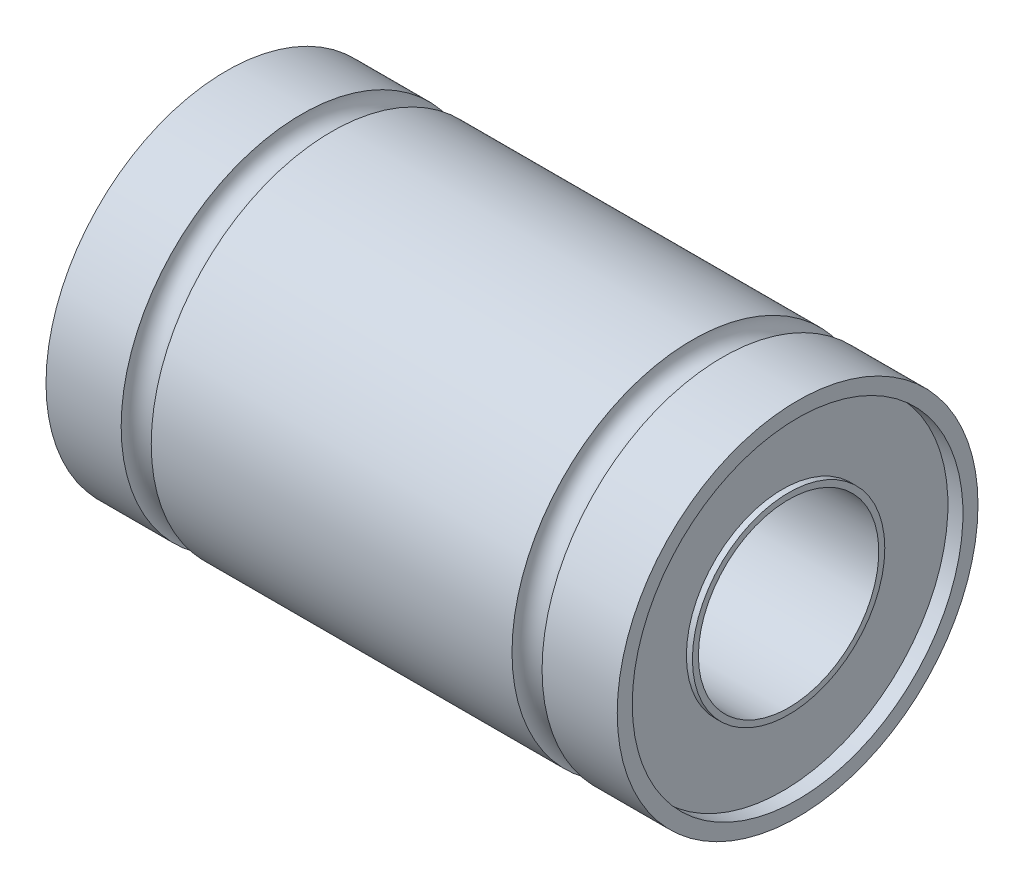
ISO-10303-21;
HEADER;
FILE_DESCRIPTION(('STEP AP214'),'2;1');
FILE_NAME('part.step','',(''),(''),'','','');
FILE_SCHEMA(('AUTOMOTIVE_DESIGN { 1 0 10303 214 1 1 1 1 }'));
ENDSEC;
DATA;
#1=APPLICATION_CONTEXT('core data for automotive mechanical design processes');
#2=APPLICATION_PROTOCOL_DEFINITION('international standard','automotive_design',2000,#1);
#3=PRODUCT_CONTEXT('',#1,'mechanical');
#4=PRODUCT('Part','Part','',(#3));
#5=PRODUCT_RELATED_PRODUCT_CATEGORY('part','',(#4));
#6=PRODUCT_DEFINITION_FORMATION('','',#4);
#7=PRODUCT_DEFINITION_CONTEXT('part definition',#1,'design');
#8=PRODUCT_DEFINITION('design','',#6,#7);
#9=PRODUCT_DEFINITION_SHAPE('','',#8);
#10=(LENGTH_UNIT() NAMED_UNIT(*) SI_UNIT(.MILLI.,.METRE.));
#11=(NAMED_UNIT(*) PLANE_ANGLE_UNIT() SI_UNIT($,.RADIAN.));
#12=(NAMED_UNIT(*) SI_UNIT($,.STERADIAN.) SOLID_ANGLE_UNIT());
#13=UNCERTAINTY_MEASURE_WITH_UNIT(LENGTH_MEASURE(1.E-05),#10,'distance_accuracy_value','');
#14=(GEOMETRIC_REPRESENTATION_CONTEXT(3) GLOBAL_UNCERTAINTY_ASSIGNED_CONTEXT((#13)) GLOBAL_UNIT_ASSIGNED_CONTEXT((#10,
#11,#12)) REPRESENTATION_CONTEXT('',''));
#15=CARTESIAN_POINT('',(0.,0.,0.));
#16=DIRECTION('',(0.,0.,1.));
#17=DIRECTION('',(1.,0.,0.));
#18=AXIS2_PLACEMENT_3D('',#15,#16,#17);
#19=CARTESIAN_POINT('',(19.,5.5,0.));
#20=DIRECTION('',(-1.,0.,0.));
#21=DIRECTION('',(0.,0.,1.));
#22=AXIS2_PLACEMENT_3D('',#19,#20,#21);
#23=PLANE('',#22);
#24=CARTESIAN_POINT('',(19.,0.,0.));
#25=DIRECTION('',(-1.,0.,0.));
#26=DIRECTION('',(0.,0.,1.));
#27=AXIS2_PLACEMENT_3D('',#24,#25,#26);
#28=CIRCLE('',#27,6.);
#29=CARTESIAN_POINT('',(19.,0.,6.));
#30=VERTEX_POINT('',#29);
#31=EDGE_CURVE('E10',#30,#30,#28,.T.);
#32=ORIENTED_EDGE('',*,*,#31,.F.);
#33=EDGE_LOOP('',(#32));
#34=FACE_BOUND('',#33,.T.);
#35=CARTESIAN_POINT('',(19.,0.,0.));
#36=DIRECTION('',(-1.,0.,0.));
#37=DIRECTION('',(0.,0.,1.));
#38=AXIS2_PLACEMENT_3D('',#35,#36,#37);
#39=CIRCLE('',#38,5.5);
#40=CARTESIAN_POINT('',(19.,0.,5.5));
#41=VERTEX_POINT('',#40);
#42=EDGE_CURVE('E88',#41,#41,#39,.T.);
#43=ORIENTED_EDGE('',*,*,#42,.T.);
#44=EDGE_LOOP('',(#43));
#45=FACE_BOUND('',#44,.T.);
#46=ADVANCED_FACE('F36',(#34,#45),#23,.F.);
#47=CARTESIAN_POINT('',(-0.95,0.,0.));
#48=DIRECTION('',(-1.,0.,0.));
#49=DIRECTION('',(0.,0.,1.));
#50=AXIS2_PLACEMENT_3D('',#47,#48,#49);
#51=CYLINDRICAL_SURFACE('',#50,6.);
#52=CARTESIAN_POINT('',(16.5,0.,0.));
#53=DIRECTION('',(-1.,0.,0.));
#54=DIRECTION('',(0.,0.,1.));
#55=AXIS2_PLACEMENT_3D('',#52,#53,#54);
#56=CIRCLE('',#55,6.);
#57=CARTESIAN_POINT('',(16.5,0.,6.));
#58=VERTEX_POINT('',#57);
#59=EDGE_CURVE('E42',#58,#58,#56,.T.);
#60=ORIENTED_EDGE('',*,*,#59,.F.);
#61=EDGE_LOOP('',(#60));
#62=FACE_BOUND('',#61,.T.);
#63=ORIENTED_EDGE('',*,*,#31,.T.);
#64=EDGE_LOOP('',(#63));
#65=FACE_BOUND('',#64,.T.);
#66=ADVANCED_FACE('F173',(#62,#65),#51,.T.);
#67=CARTESIAN_POINT('',(16.,0.,0.));
#68=DIRECTION('',(-1.,0.,0.));
#69=DIRECTION('',(0.,0.,1.));
#70=AXIS2_PLACEMENT_3D('',#67,#68,#69);
#71=TOROIDAL_SURFACE('',#70,6.,0.5);
#72=CARTESIAN_POINT('',(15.5,0.,0.));
#73=DIRECTION('',(-1.,0.,0.));
#74=DIRECTION('',(0.,0.,1.));
#75=AXIS2_PLACEMENT_3D('',#72,#73,#74);
#76=CIRCLE('',#75,6.);
#77=CARTESIAN_POINT('',(15.5,0.,6.));
#78=VERTEX_POINT('',#77);
#79=EDGE_CURVE('E46',#78,#78,#76,.T.);
#80=ORIENTED_EDGE('',*,*,#79,.F.);
#81=EDGE_LOOP('',(#80));
#82=FACE_BOUND('',#81,.T.);
#83=ORIENTED_EDGE('',*,*,#59,.T.);
#84=EDGE_LOOP('',(#83));
#85=FACE_BOUND('',#84,.T.);
#86=ADVANCED_FACE('F168',(#82,#85),#71,.F.);
#87=CARTESIAN_POINT('',(-0.95,0.,0.));
#88=DIRECTION('',(-1.,0.,0.));
#89=DIRECTION('',(0.,0.,1.));
#90=AXIS2_PLACEMENT_3D('',#87,#88,#89);
#91=CYLINDRICAL_SURFACE('',#90,6.);
#92=CARTESIAN_POINT('',(3.5,0.,0.));
#93=DIRECTION('',(-1.,0.,0.));
#94=DIRECTION('',(0.,0.,1.));
#95=AXIS2_PLACEMENT_3D('',#92,#93,#94);
#96=CIRCLE('',#95,6.);
#97=CARTESIAN_POINT('',(3.5,0.,6.));
#98=VERTEX_POINT('',#97);
#99=EDGE_CURVE('E50',#98,#98,#96,.T.);
#100=ORIENTED_EDGE('',*,*,#99,.F.);
#101=EDGE_LOOP('',(#100));
#102=FACE_BOUND('',#101,.T.);
#103=ORIENTED_EDGE('',*,*,#79,.T.);
#104=EDGE_LOOP('',(#103));
#105=FACE_BOUND('',#104,.T.);
#106=ADVANCED_FACE('F162',(#102,#105),#91,.T.);
#107=CARTESIAN_POINT('',(3.,0.,0.));
#108=DIRECTION('',(-1.,0.,0.));
#109=DIRECTION('',(0.,0.,1.));
#110=AXIS2_PLACEMENT_3D('',#107,#108,#109);
#111=TOROIDAL_SURFACE('',#110,6.,0.5);
#112=CARTESIAN_POINT('',(2.5,0.,0.));
#113=DIRECTION('',(-1.,0.,0.));
#114=DIRECTION('',(0.,0.,1.));
#115=AXIS2_PLACEMENT_3D('',#112,#113,#114);
#116=CIRCLE('',#115,6.);
#117=CARTESIAN_POINT('',(2.5,0.,6.));
#118=VERTEX_POINT('',#117);
#119=EDGE_CURVE('E55',#118,#118,#116,.T.);
#120=ORIENTED_EDGE('',*,*,#119,.F.);
#121=EDGE_LOOP('',(#120));
#122=FACE_BOUND('',#121,.T.);
#123=ORIENTED_EDGE('',*,*,#99,.T.);
#124=EDGE_LOOP('',(#123));
#125=FACE_BOUND('',#124,.T.);
#126=ADVANCED_FACE('F156',(#122,#125),#111,.F.);
#127=CARTESIAN_POINT('',(-0.95,0.,0.));
#128=DIRECTION('',(-1.,0.,0.));
#129=DIRECTION('',(0.,0.,1.));
#130=AXIS2_PLACEMENT_3D('',#127,#128,#129);
#131=CYLINDRICAL_SURFACE('',#130,6.);
#132=CARTESIAN_POINT('',(0.,0.,0.));
#133=DIRECTION('',(-1.,0.,0.));
#134=DIRECTION('',(0.,0.,1.));
#135=AXIS2_PLACEMENT_3D('',#132,#133,#134);
#136=CIRCLE('',#135,6.);
#137=CARTESIAN_POINT('',(0.,0.,6.));
#138=VERTEX_POINT('',#137);
#139=EDGE_CURVE('E58',#138,#138,#136,.T.);
#140=ORIENTED_EDGE('',*,*,#139,.F.);
#141=EDGE_LOOP('',(#140));
#142=FACE_BOUND('',#141,.T.);
#143=ORIENTED_EDGE('',*,*,#119,.T.);
#144=EDGE_LOOP('',(#143));
#145=FACE_BOUND('',#144,.T.);
#146=ADVANCED_FACE('F150',(#142,#145),#131,.T.);
#147=CARTESIAN_POINT('',(0.,5.5,0.));
#148=DIRECTION('',(1.,0.,0.));
#149=DIRECTION('',(0.,0.,-1.));
#150=AXIS2_PLACEMENT_3D('',#147,#148,#149);
#151=PLANE('',#150);
#152=CARTESIAN_POINT('',(0.,0.,0.));
#153=DIRECTION('',(-1.,0.,0.));
#154=DIRECTION('',(0.,0.,1.));
#155=AXIS2_PLACEMENT_3D('',#152,#153,#154);
#156=CIRCLE('',#155,5.5);
#157=CARTESIAN_POINT('',(0.,0.,5.5));
#158=VERTEX_POINT('',#157);
#159=EDGE_CURVE('E61',#158,#158,#156,.T.);
#160=ORIENTED_EDGE('',*,*,#159,.F.);
#161=EDGE_LOOP('',(#160));
#162=FACE_BOUND('',#161,.T.);
#163=ORIENTED_EDGE('',*,*,#139,.T.);
#164=EDGE_LOOP('',(#163));
#165=FACE_BOUND('',#164,.T.);
#166=ADVANCED_FACE('F144',(#162,#165),#151,.F.);
#167=CARTESIAN_POINT('',(-0.95,0.,0.));
#168=DIRECTION('',(-1.,0.,0.));
#169=DIRECTION('',(0.,0.,1.));
#170=AXIS2_PLACEMENT_3D('',#167,#168,#169);
#171=CYLINDRICAL_SURFACE('',#170,5.5);
#172=CARTESIAN_POINT('',(0.5,0.,0.));
#173=DIRECTION('',(-1.,0.,0.));
#174=DIRECTION('',(0.,0.,1.));
#175=AXIS2_PLACEMENT_3D('',#172,#173,#174);
#176=CIRCLE('',#175,5.5);
#177=CARTESIAN_POINT('',(0.5,0.,5.5));
#178=VERTEX_POINT('',#177);
#179=EDGE_CURVE('E64',#178,#178,#176,.T.);
#180=ORIENTED_EDGE('',*,*,#179,.F.);
#181=EDGE_LOOP('',(#180));
#182=FACE_BOUND('',#181,.T.);
#183=ORIENTED_EDGE('',*,*,#159,.T.);
#184=EDGE_LOOP('',(#183));
#185=FACE_BOUND('',#184,.T.);
#186=ADVANCED_FACE('F138',(#182,#185),#171,.F.);
#187=CARTESIAN_POINT('',(0.5,5.5,0.));
#188=DIRECTION('',(1.,0.,0.));
#189=DIRECTION('',(0.,0.,-1.));
#190=AXIS2_PLACEMENT_3D('',#187,#188,#189);
#191=PLANE('',#190);
#192=CARTESIAN_POINT('',(0.5,0.,0.));
#193=DIRECTION('',(-1.,0.,0.));
#194=DIRECTION('',(0.,0.,1.));
#195=AXIS2_PLACEMENT_3D('',#192,#193,#194);
#196=CIRCLE('',#195,3.2);
#197=CARTESIAN_POINT('',(0.5,0.,3.2));
#198=VERTEX_POINT('',#197);
#199=EDGE_CURVE('E67',#198,#198,#196,.T.);
#200=ORIENTED_EDGE('',*,*,#199,.F.);
#201=EDGE_LOOP('',(#200));
#202=FACE_BOUND('',#201,.T.);
#203=ORIENTED_EDGE('',*,*,#179,.T.);
#204=EDGE_LOOP('',(#203));
#205=FACE_BOUND('',#204,.T.);
#206=ADVANCED_FACE('F132',(#202,#205),#191,.F.);
#207=CARTESIAN_POINT('',(-0.95,0.,0.));
#208=DIRECTION('',(-1.,0.,0.));
#209=DIRECTION('',(0.,0.,1.));
#210=AXIS2_PLACEMENT_3D('',#207,#208,#209);
#211=CYLINDRICAL_SURFACE('',#210,3.2);
#212=CARTESIAN_POINT('',(0.3,0.,0.));
#213=DIRECTION('',(-1.,0.,0.));
#214=DIRECTION('',(0.,0.,1.));
#215=AXIS2_PLACEMENT_3D('',#212,#213,#214);
#216=CIRCLE('',#215,3.2);
#217=CARTESIAN_POINT('',(0.3,0.,3.2));
#218=VERTEX_POINT('',#217);
#219=EDGE_CURVE('E70',#218,#218,#216,.T.);
#220=ORIENTED_EDGE('',*,*,#219,.F.);
#221=EDGE_LOOP('',(#220));
#222=FACE_BOUND('',#221,.T.);
#223=ORIENTED_EDGE('',*,*,#199,.T.);
#224=EDGE_LOOP('',(#223));
#225=FACE_BOUND('',#224,.T.);
#226=ADVANCED_FACE('F126',(#222,#225),#211,.T.);
#227=CARTESIAN_POINT('',(0.3,3.2,0.));
#228=DIRECTION('',(1.,0.,0.));
#229=DIRECTION('',(0.,0.,-1.));
#230=AXIS2_PLACEMENT_3D('',#227,#228,#229);
#231=PLANE('',#230);
#232=CARTESIAN_POINT('',(0.3,0.,0.));
#233=DIRECTION('',(-1.,0.,0.));
#234=DIRECTION('',(0.,0.,1.));
#235=AXIS2_PLACEMENT_3D('',#232,#233,#234);
#236=CIRCLE('',#235,3.);
#237=CARTESIAN_POINT('',(0.3,0.,3.));
#238=VERTEX_POINT('',#237);
#239=EDGE_CURVE('E73',#238,#238,#236,.T.);
#240=ORIENTED_EDGE('',*,*,#239,.F.);
#241=EDGE_LOOP('',(#240));
#242=FACE_BOUND('',#241,.T.);
#243=ORIENTED_EDGE('',*,*,#219,.T.);
#244=EDGE_LOOP('',(#243));
#245=FACE_BOUND('',#244,.T.);
#246=ADVANCED_FACE('F120',(#242,#245),#231,.F.);
#247=CARTESIAN_POINT('',(-0.95,0.,0.));
#248=DIRECTION('',(-1.,0.,0.));
#249=DIRECTION('',(0.,0.,1.));
#250=AXIS2_PLACEMENT_3D('',#247,#248,#249);
#251=CYLINDRICAL_SURFACE('',#250,3.);
#252=CARTESIAN_POINT('',(18.7,0.,0.));
#253=DIRECTION('',(-1.,0.,0.));
#254=DIRECTION('',(0.,0.,1.));
#255=AXIS2_PLACEMENT_3D('',#252,#253,#254);
#256=CIRCLE('',#255,3.);
#257=CARTESIAN_POINT('',(18.7,0.,3.));
#258=VERTEX_POINT('',#257);
#259=EDGE_CURVE('E76',#258,#258,#256,.T.);
#260=ORIENTED_EDGE('',*,*,#259,.F.);
#261=EDGE_LOOP('',(#260));
#262=FACE_BOUND('',#261,.T.);
#263=ORIENTED_EDGE('',*,*,#239,.T.);
#264=EDGE_LOOP('',(#263));
#265=FACE_BOUND('',#264,.T.);
#266=ADVANCED_FACE('F114',(#262,#265),#251,.F.);
#267=CARTESIAN_POINT('',(18.7,3.2,0.));
#268=DIRECTION('',(-1.,0.,0.));
#269=DIRECTION('',(0.,0.,1.));
#270=AXIS2_PLACEMENT_3D('',#267,#268,#269);
#271=PLANE('',#270);
#272=CARTESIAN_POINT('',(18.7,0.,0.));
#273=DIRECTION('',(-1.,0.,0.));
#274=DIRECTION('',(0.,0.,1.));
#275=AXIS2_PLACEMENT_3D('',#272,#273,#274);
#276=CIRCLE('',#275,3.2);
#277=CARTESIAN_POINT('',(18.7,0.,3.2));
#278=VERTEX_POINT('',#277);
#279=EDGE_CURVE('E79',#278,#278,#276,.T.);
#280=ORIENTED_EDGE('',*,*,#279,.F.);
#281=EDGE_LOOP('',(#280));
#282=FACE_BOUND('',#281,.T.);
#283=ORIENTED_EDGE('',*,*,#259,.T.);
#284=EDGE_LOOP('',(#283));
#285=FACE_BOUND('',#284,.T.);
#286=ADVANCED_FACE('F108',(#282,#285),#271,.F.);
#287=CARTESIAN_POINT('',(-0.95,0.,0.));
#288=DIRECTION('',(-1.,0.,0.));
#289=DIRECTION('',(0.,0.,1.));
#290=AXIS2_PLACEMENT_3D('',#287,#288,#289);
#291=CYLINDRICAL_SURFACE('',#290,3.2);
#292=CARTESIAN_POINT('',(18.5,0.,0.));
#293=DIRECTION('',(-1.,0.,0.));
#294=DIRECTION('',(0.,0.,1.));
#295=AXIS2_PLACEMENT_3D('',#292,#293,#294);
#296=CIRCLE('',#295,3.2);
#297=CARTESIAN_POINT('',(18.5,0.,3.2));
#298=VERTEX_POINT('',#297);
#299=EDGE_CURVE('E82',#298,#298,#296,.T.);
#300=ORIENTED_EDGE('',*,*,#299,.F.);
#301=EDGE_LOOP('',(#300));
#302=FACE_BOUND('',#301,.T.);
#303=ORIENTED_EDGE('',*,*,#279,.T.);
#304=EDGE_LOOP('',(#303));
#305=FACE_BOUND('',#304,.T.);
#306=ADVANCED_FACE('F102',(#302,#305),#291,.T.);
#307=CARTESIAN_POINT('',(18.5,5.5,0.));
#308=DIRECTION('',(-1.,0.,0.));
#309=DIRECTION('',(0.,0.,1.));
#310=AXIS2_PLACEMENT_3D('',#307,#308,#309);
#311=PLANE('',#310);
#312=CARTESIAN_POINT('',(18.5,0.,0.));
#313=DIRECTION('',(-1.,0.,0.));
#314=DIRECTION('',(0.,0.,1.));
#315=AXIS2_PLACEMENT_3D('',#312,#313,#314);
#316=CIRCLE('',#315,5.5);
#317=CARTESIAN_POINT('',(18.5,0.,5.5));
#318=VERTEX_POINT('',#317);
#319=EDGE_CURVE('E85',#318,#318,#316,.T.);
#320=ORIENTED_EDGE('',*,*,#319,.F.);
#321=EDGE_LOOP('',(#320));
#322=FACE_BOUND('',#321,.T.);
#323=ORIENTED_EDGE('',*,*,#299,.T.);
#324=EDGE_LOOP('',(#323));
#325=FACE_BOUND('',#324,.T.);
#326=ADVANCED_FACE('F96',(#322,#325),#311,.F.);
#327=CARTESIAN_POINT('',(-0.95,0.,0.));
#328=DIRECTION('',(-1.,0.,0.));
#329=DIRECTION('',(0.,0.,1.));
#330=AXIS2_PLACEMENT_3D('',#327,#328,#329);
#331=CYLINDRICAL_SURFACE('',#330,5.5);
#332=ORIENTED_EDGE('',*,*,#42,.F.);
#333=EDGE_LOOP('',(#332));
#334=FACE_BOUND('',#333,.T.);
#335=ORIENTED_EDGE('',*,*,#319,.T.);
#336=EDGE_LOOP('',(#335));
#337=FACE_BOUND('',#336,.T.);
#338=ADVANCED_FACE('F93',(#334,#337),#331,.F.);
#339=CLOSED_SHELL('',(#46,#66,#86,#106,#126,#146,#166,#186,#206,#226,#246,#266,#286,#306,#326,#338));
#340=MANIFOLD_SOLID_BREP('B2',#339);
#341=ADVANCED_BREP_SHAPE_REPRESENTATION('',(#18,#340),#14);
#342=SHAPE_DEFINITION_REPRESENTATION(#9,#341);
ENDSEC;
END-ISO-10303-21;
